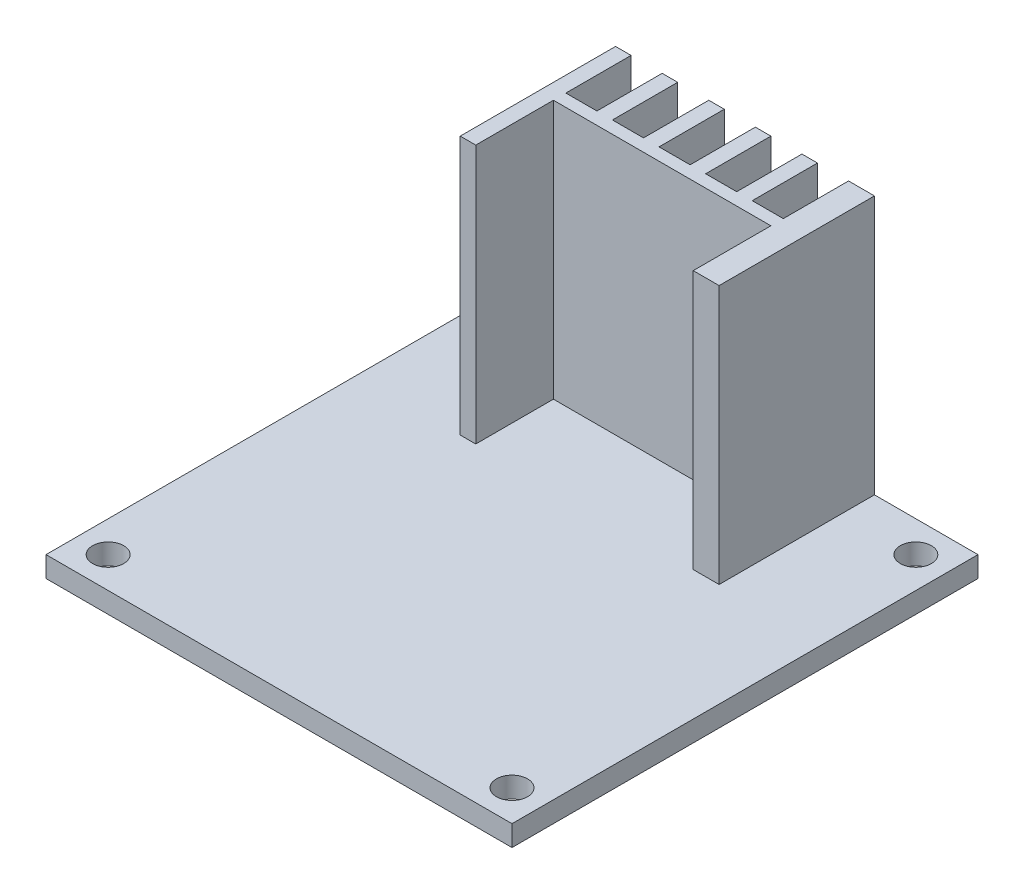
ISO-10303-21;
HEADER;
FILE_DESCRIPTION(('STEP AP214'),'2;1');
FILE_NAME('part.step','',(''),(''),'','','');
FILE_SCHEMA(('AUTOMOTIVE_DESIGN { 1 0 10303 214 1 1 1 1 }'));
ENDSEC;
DATA;
#1=APPLICATION_CONTEXT('core data for automotive mechanical design processes');
#2=APPLICATION_PROTOCOL_DEFINITION('international standard','automotive_design',2000,#1);
#3=PRODUCT_CONTEXT('',#1,'mechanical');
#4=PRODUCT('Part','Part','',(#3));
#5=PRODUCT_RELATED_PRODUCT_CATEGORY('part','',(#4));
#6=PRODUCT_DEFINITION_FORMATION('','',#4);
#7=PRODUCT_DEFINITION_CONTEXT('part definition',#1,'design');
#8=PRODUCT_DEFINITION('design','',#6,#7);
#9=PRODUCT_DEFINITION_SHAPE('','',#8);
#10=(LENGTH_UNIT() NAMED_UNIT(*) SI_UNIT(.MILLI.,.METRE.));
#11=(NAMED_UNIT(*) PLANE_ANGLE_UNIT() SI_UNIT($,.RADIAN.));
#12=(NAMED_UNIT(*) SI_UNIT($,.STERADIAN.) SOLID_ANGLE_UNIT());
#13=UNCERTAINTY_MEASURE_WITH_UNIT(LENGTH_MEASURE(1.E-05),#10,'distance_accuracy_value','');
#14=(GEOMETRIC_REPRESENTATION_CONTEXT(3) GLOBAL_UNCERTAINTY_ASSIGNED_CONTEXT((#13)) GLOBAL_UNIT_ASSIGNED_CONTEXT((#10,
#11,#12)) REPRESENTATION_CONTEXT('',''));
#15=CARTESIAN_POINT('',(0.,0.,0.));
#16=DIRECTION('',(0.,0.,1.));
#17=DIRECTION('',(1.,0.,0.));
#18=AXIS2_PLACEMENT_3D('',#15,#16,#17);
#19=CARTESIAN_POINT('',(22.5,2.,-22.5));
#20=DIRECTION('',(0.,0.,1.));
#21=DIRECTION('',(1.,0.,0.));
#22=AXIS2_PLACEMENT_3D('',#19,#20,#21);
#23=PLANE('',#22);
#24=DIRECTION('',(1.,0.,0.));
#25=VECTOR('',#24,1.);
#26=CARTESIAN_POINT('',(22.5,2.,-22.5));
#27=LINE('',#26,#25);
#28=CARTESIAN_POINT('',(-12.5,2.,-22.5));
#29=VERTEX_POINT('',#28);
#30=CARTESIAN_POINT('',(-11.,2.,-22.5));
#31=VERTEX_POINT('',#30);
#32=EDGE_CURVE('E11',#29,#31,#27,.T.);
#33=ORIENTED_EDGE('',*,*,#32,.F.);
#34=DIRECTION('',(0.,-1.,0.));
#35=VECTOR('',#34,1.);
#36=CARTESIAN_POINT('',(-12.5,27.,-22.5));
#37=LINE('',#36,#35);
#38=CARTESIAN_POINT('',(-12.5,27.,-22.5));
#39=VERTEX_POINT('',#38);
#40=EDGE_CURVE('E706',#39,#29,#37,.T.);
#41=ORIENTED_EDGE('',*,*,#40,.F.);
#42=DIRECTION('',(-1.,0.,0.));
#43=VECTOR('',#42,1.);
#44=CARTESIAN_POINT('',(0.,27.,-22.5));
#45=LINE('',#44,#43);
#46=CARTESIAN_POINT('',(-11.,27.,-22.5));
#47=VERTEX_POINT('',#46);
#48=EDGE_CURVE('E293',#47,#39,#45,.T.);
#49=ORIENTED_EDGE('',*,*,#48,.F.);
#50=DIRECTION('',(0.,-1.,0.));
#51=VECTOR('',#50,1.);
#52=CARTESIAN_POINT('',(-11.,27.,-22.5));
#53=LINE('',#52,#51);
#54=EDGE_CURVE('E455',#47,#31,#53,.T.);
#55=ORIENTED_EDGE('',*,*,#54,.T.);
#56=EDGE_LOOP('',(#33,#41,#49,#55));
#57=FACE_BOUND('',#56,.T.);
#58=ADVANCED_FACE('F41',(#57),#23,.F.);
#59=CARTESIAN_POINT('',(-7.99999999999999,2.,-22.5));
#60=VERTEX_POINT('',#59);
#61=CARTESIAN_POINT('',(-6.49999999999998,2.,-22.5));
#62=VERTEX_POINT('',#61);
#63=EDGE_CURVE('E51',#60,#62,#27,.T.);
#64=ORIENTED_EDGE('',*,*,#63,.F.);
#65=DIRECTION('',(0.,-1.,0.));
#66=VECTOR('',#65,1.);
#67=CARTESIAN_POINT('',(-8.,27.,-22.5));
#68=LINE('',#67,#66);
#69=CARTESIAN_POINT('',(-8.,27.,-22.5));
#70=VERTEX_POINT('',#69);
#71=EDGE_CURVE('E419',#70,#60,#68,.T.);
#72=ORIENTED_EDGE('',*,*,#71,.F.);
#73=CARTESIAN_POINT('',(-6.5,27.,-22.5));
#74=VERTEX_POINT('',#73);
#75=EDGE_CURVE('E332',#74,#70,#45,.T.);
#76=ORIENTED_EDGE('',*,*,#75,.F.);
#77=DIRECTION('',(0.,-1.,0.));
#78=VECTOR('',#77,1.);
#79=CARTESIAN_POINT('',(-6.5,27.,-22.5));
#80=LINE('',#79,#78);
#81=EDGE_CURVE('E414',#74,#62,#80,.T.);
#82=ORIENTED_EDGE('',*,*,#81,.T.);
#83=EDGE_LOOP('',(#64,#72,#76,#82));
#84=FACE_BOUND('',#83,.T.);
#85=ADVANCED_FACE('F415',(#84),#23,.F.);
#86=CARTESIAN_POINT('',(-3.49999999999999,2.,-22.5));
#87=VERTEX_POINT('',#86);
#88=CARTESIAN_POINT('',(-1.99999999999998,2.,-22.5));
#89=VERTEX_POINT('',#88);
#90=EDGE_CURVE('E384',#87,#89,#27,.T.);
#91=ORIENTED_EDGE('',*,*,#90,.F.);
#92=DIRECTION('',(0.,-1.,0.));
#93=VECTOR('',#92,1.);
#94=CARTESIAN_POINT('',(-3.5,27.,-22.5));
#95=LINE('',#94,#93);
#96=CARTESIAN_POINT('',(-3.5,27.,-22.5));
#97=VERTEX_POINT('',#96);
#98=EDGE_CURVE('E461',#97,#87,#95,.T.);
#99=ORIENTED_EDGE('',*,*,#98,.F.);
#100=CARTESIAN_POINT('',(-2.,27.,-22.5));
#101=VERTEX_POINT('',#100);
#102=EDGE_CURVE('E322',#101,#97,#45,.T.);
#103=ORIENTED_EDGE('',*,*,#102,.F.);
#104=DIRECTION('',(0.,-1.,0.));
#105=VECTOR('',#104,1.);
#106=CARTESIAN_POINT('',(-2.,27.,-22.5));
#107=LINE('',#106,#105);
#108=EDGE_CURVE('E466',#101,#89,#107,.T.);
#109=ORIENTED_EDGE('',*,*,#108,.T.);
#110=EDGE_LOOP('',(#91,#99,#103,#109));
#111=FACE_BOUND('',#110,.T.);
#112=ADVANCED_FACE('F612',(#111),#23,.F.);
#113=CARTESIAN_POINT('',(1.00000000000001,2.,-22.5));
#114=VERTEX_POINT('',#113);
#115=CARTESIAN_POINT('',(2.50000000000002,2.,-22.5));
#116=VERTEX_POINT('',#115);
#117=EDGE_CURVE('E381',#114,#116,#27,.T.);
#118=ORIENTED_EDGE('',*,*,#117,.F.);
#119=DIRECTION('',(0.,-1.,0.));
#120=VECTOR('',#119,1.);
#121=CARTESIAN_POINT('',(1.,27.,-22.5));
#122=LINE('',#121,#120);
#123=CARTESIAN_POINT('',(1.,27.,-22.5));
#124=VERTEX_POINT('',#123);
#125=EDGE_CURVE('E469',#124,#114,#122,.T.);
#126=ORIENTED_EDGE('',*,*,#125,.F.);
#127=CARTESIAN_POINT('',(2.5,27.,-22.5));
#128=VERTEX_POINT('',#127);
#129=EDGE_CURVE('E312',#128,#124,#45,.T.);
#130=ORIENTED_EDGE('',*,*,#129,.F.);
#131=DIRECTION('',(0.,-1.,0.));
#132=VECTOR('',#131,1.);
#133=CARTESIAN_POINT('',(2.5,27.,-22.5));
#134=LINE('',#133,#132);
#135=EDGE_CURVE('E474',#128,#116,#134,.T.);
#136=ORIENTED_EDGE('',*,*,#135,.T.);
#137=EDGE_LOOP('',(#118,#126,#130,#136));
#138=FACE_BOUND('',#137,.T.);
#139=ADVANCED_FACE('F632',(#138),#23,.F.);
#140=CARTESIAN_POINT('',(5.50000000000002,2.,-22.5));
#141=VERTEX_POINT('',#140);
#142=CARTESIAN_POINT('',(7.00000000000001,2.,-22.5));
#143=VERTEX_POINT('',#142);
#144=EDGE_CURVE('E377',#141,#143,#27,.T.);
#145=ORIENTED_EDGE('',*,*,#144,.F.);
#146=DIRECTION('',(0.,-1.,0.));
#147=VECTOR('',#146,1.);
#148=CARTESIAN_POINT('',(5.5,27.,-22.5));
#149=LINE('',#148,#147);
#150=CARTESIAN_POINT('',(5.5,27.,-22.5));
#151=VERTEX_POINT('',#150);
#152=EDGE_CURVE('E477',#151,#141,#149,.T.);
#153=ORIENTED_EDGE('',*,*,#152,.F.);
#154=CARTESIAN_POINT('',(7.,27.,-22.5));
#155=VERTEX_POINT('',#154);
#156=EDGE_CURVE('E294',#155,#151,#45,.T.);
#157=ORIENTED_EDGE('',*,*,#156,.F.);
#158=DIRECTION('',(0.,-1.,0.));
#159=VECTOR('',#158,1.);
#160=CARTESIAN_POINT('',(7.,27.,-22.5));
#161=LINE('',#160,#159);
#162=EDGE_CURVE('E482',#155,#143,#161,.T.);
#163=ORIENTED_EDGE('',*,*,#162,.T.);
#164=EDGE_LOOP('',(#145,#153,#157,#163));
#165=FACE_BOUND('',#164,.T.);
#166=ADVANCED_FACE('F625',(#165),#23,.F.);
#167=CARTESIAN_POINT('',(10.,2.,-22.5));
#168=VERTEX_POINT('',#167);
#169=CARTESIAN_POINT('',(12.5,2.,-22.5));
#170=VERTEX_POINT('',#169);
#171=EDGE_CURVE('E374',#168,#170,#27,.T.);
#172=ORIENTED_EDGE('',*,*,#171,.F.);
#173=DIRECTION('',(0.,-1.,0.));
#174=VECTOR('',#173,1.);
#175=CARTESIAN_POINT('',(10.,27.,-22.5));
#176=LINE('',#175,#174);
#177=CARTESIAN_POINT('',(10.,27.,-22.5));
#178=VERTEX_POINT('',#177);
#179=EDGE_CURVE('E371',#178,#168,#176,.T.);
#180=ORIENTED_EDGE('',*,*,#179,.F.);
#181=CARTESIAN_POINT('',(12.5,27.,-22.5));
#182=VERTEX_POINT('',#181);
#183=EDGE_CURVE('E290',#182,#178,#45,.T.);
#184=ORIENTED_EDGE('',*,*,#183,.F.);
#185=DIRECTION('',(0.,-1.,0.));
#186=VECTOR('',#185,1.);
#187=CARTESIAN_POINT('',(12.5,27.,-22.5));
#188=LINE('',#187,#186);
#189=EDGE_CURVE('E367',#182,#170,#188,.T.);
#190=ORIENTED_EDGE('',*,*,#189,.T.);
#191=EDGE_LOOP('',(#172,#180,#184,#190));
#192=FACE_BOUND('',#191,.T.);
#193=ADVANCED_FACE('F616',(#192),#23,.F.);
#194=CARTESIAN_POINT('',(0.,2.,0.));
#195=DIRECTION('',(0.,1.,0.));
#196=DIRECTION('',(0.,0.,1.));
#197=AXIS2_PLACEMENT_3D('',#194,#195,#196);
#198=PLANE('',#197);
#199=DIRECTION('',(-1.,0.,0.));
#200=VECTOR('',#199,1.);
#201=CARTESIAN_POINT('',(22.5,2.,-22.5));
#202=LINE('',#201,#200);
#203=EDGE_CURVE('E398',#60,#31,#202,.T.);
#204=ORIENTED_EDGE('',*,*,#203,.T.);
#205=DIRECTION('',(0.,0.,1.));
#206=VECTOR('',#205,1.);
#207=CARTESIAN_POINT('',(-11.,2.,0.));
#208=LINE('',#207,#206);
#209=CARTESIAN_POINT('',(-11.,2.,-16.2));
#210=VERTEX_POINT('',#209);
#211=EDGE_CURVE('E58',#31,#210,#208,.T.);
#212=ORIENTED_EDGE('',*,*,#211,.T.);
#213=DIRECTION('',(1.,0.,0.));
#214=VECTOR('',#213,1.);
#215=CARTESIAN_POINT('',(0.,2.,-16.2));
#216=LINE('',#215,#214);
#217=CARTESIAN_POINT('',(-8.,2.,-16.2));
#218=VERTEX_POINT('',#217);
#219=EDGE_CURVE('E63',#210,#218,#216,.T.);
#220=ORIENTED_EDGE('',*,*,#219,.T.);
#221=DIRECTION('',(0.,0.,-1.));
#222=VECTOR('',#221,1.);
#223=CARTESIAN_POINT('',(-8.,2.,0.));
#224=LINE('',#223,#222);
#225=EDGE_CURVE('E423',#218,#60,#224,.T.);
#226=ORIENTED_EDGE('',*,*,#225,.T.);
#227=EDGE_LOOP('',(#204,#212,#220,#226));
#228=FACE_BOUND('',#227,.T.);
#229=ADVANCED_FACE('F624',(#228),#198,.T.);
#230=EDGE_CURVE('E396',#87,#62,#202,.T.);
#231=ORIENTED_EDGE('',*,*,#230,.T.);
#232=DIRECTION('',(0.,0.,1.));
#233=VECTOR('',#232,1.);
#234=CARTESIAN_POINT('',(-6.5,2.,0.));
#235=LINE('',#234,#233);
#236=CARTESIAN_POINT('',(-6.5,2.,-16.2));
#237=VERTEX_POINT('',#236);
#238=EDGE_CURVE('E407',#62,#237,#235,.T.);
#239=ORIENTED_EDGE('',*,*,#238,.T.);
#240=DIRECTION('',(1.,0.,0.));
#241=VECTOR('',#240,1.);
#242=CARTESIAN_POINT('',(0.,2.,-16.2));
#243=LINE('',#242,#241);
#244=CARTESIAN_POINT('',(-3.5,2.,-16.2));
#245=VERTEX_POINT('',#244);
#246=EDGE_CURVE('E424',#237,#245,#243,.T.);
#247=ORIENTED_EDGE('',*,*,#246,.T.);
#248=DIRECTION('',(0.,0.,-1.));
#249=VECTOR('',#248,1.);
#250=CARTESIAN_POINT('',(-3.5,2.,0.));
#251=LINE('',#250,#249);
#252=EDGE_CURVE('E410',#245,#87,#251,.T.);
#253=ORIENTED_EDGE('',*,*,#252,.T.);
#254=EDGE_LOOP('',(#231,#239,#247,#253));
#255=FACE_BOUND('',#254,.T.);
#256=ADVANCED_FACE('F405',(#255),#198,.T.);
#257=EDGE_CURVE('E411',#114,#89,#202,.T.);
#258=ORIENTED_EDGE('',*,*,#257,.T.);
#259=DIRECTION('',(0.,0.,1.));
#260=VECTOR('',#259,1.);
#261=CARTESIAN_POINT('',(-2.,2.,0.));
#262=LINE('',#261,#260);
#263=CARTESIAN_POINT('',(-2.,2.,-16.2));
#264=VERTEX_POINT('',#263);
#265=EDGE_CURVE('E958',#89,#264,#262,.T.);
#266=ORIENTED_EDGE('',*,*,#265,.T.);
#267=DIRECTION('',(1.,0.,0.));
#268=VECTOR('',#267,1.);
#269=CARTESIAN_POINT('',(0.,2.,-16.2));
#270=LINE('',#269,#268);
#271=CARTESIAN_POINT('',(1.,2.,-16.2));
#272=VERTEX_POINT('',#271);
#273=EDGE_CURVE('E668',#264,#272,#270,.T.);
#274=ORIENTED_EDGE('',*,*,#273,.T.);
#275=DIRECTION('',(0.,0.,-1.));
#276=VECTOR('',#275,1.);
#277=CARTESIAN_POINT('',(1.,2.,0.));
#278=LINE('',#277,#276);
#279=EDGE_CURVE('E672',#272,#114,#278,.T.);
#280=ORIENTED_EDGE('',*,*,#279,.T.);
#281=EDGE_LOOP('',(#258,#266,#274,#280));
#282=FACE_BOUND('',#281,.T.);
#283=ADVANCED_FACE('F947',(#282),#198,.T.);
#284=EDGE_CURVE('E544',#141,#116,#202,.T.);
#285=ORIENTED_EDGE('',*,*,#284,.T.);
#286=DIRECTION('',(0.,0.,1.));
#287=VECTOR('',#286,1.);
#288=CARTESIAN_POINT('',(2.50000000000001,2.,0.));
#289=LINE('',#288,#287);
#290=CARTESIAN_POINT('',(2.5,2.,-16.2));
#291=VERTEX_POINT('',#290);
#292=EDGE_CURVE('E665',#116,#291,#289,.T.);
#293=ORIENTED_EDGE('',*,*,#292,.T.);
#294=DIRECTION('',(1.,0.,0.));
#295=VECTOR('',#294,1.);
#296=CARTESIAN_POINT('',(0.,2.,-16.2));
#297=LINE('',#296,#295);
#298=CARTESIAN_POINT('',(5.5,2.,-16.2));
#299=VERTEX_POINT('',#298);
#300=EDGE_CURVE('E663',#291,#299,#297,.T.);
#301=ORIENTED_EDGE('',*,*,#300,.T.);
#302=DIRECTION('',(0.,0.,-1.));
#303=VECTOR('',#302,1.);
#304=CARTESIAN_POINT('',(5.5,2.,0.));
#305=LINE('',#304,#303);
#306=EDGE_CURVE('E658',#299,#141,#305,.T.);
#307=ORIENTED_EDGE('',*,*,#306,.T.);
#308=EDGE_LOOP('',(#285,#293,#301,#307));
#309=FACE_BOUND('',#308,.T.);
#310=ADVANCED_FACE('F981',(#309),#198,.T.);
#311=EDGE_CURVE('E541',#168,#143,#202,.T.);
#312=ORIENTED_EDGE('',*,*,#311,.T.);
#313=DIRECTION('',(0.,0.,1.));
#314=VECTOR('',#313,1.);
#315=CARTESIAN_POINT('',(7.,2.,0.));
#316=LINE('',#315,#314);
#317=CARTESIAN_POINT('',(7.,2.,-16.2));
#318=VERTEX_POINT('',#317);
#319=EDGE_CURVE('E656',#143,#318,#316,.T.);
#320=ORIENTED_EDGE('',*,*,#319,.T.);
#321=DIRECTION('',(1.,0.,0.));
#322=VECTOR('',#321,1.);
#323=CARTESIAN_POINT('',(0.,2.,-16.2));
#324=LINE('',#323,#322);
#325=CARTESIAN_POINT('',(10.,2.,-16.2));
#326=VERTEX_POINT('',#325);
#327=EDGE_CURVE('E358',#318,#326,#324,.T.);
#328=ORIENTED_EDGE('',*,*,#327,.T.);
#329=DIRECTION('',(0.,0.,-1.));
#330=VECTOR('',#329,1.);
#331=CARTESIAN_POINT('',(10.,2.,0.));
#332=LINE('',#331,#330);
#333=EDGE_CURVE('E364',#326,#168,#332,.T.);
#334=ORIENTED_EDGE('',*,*,#333,.T.);
#335=EDGE_LOOP('',(#312,#320,#328,#334));
#336=FACE_BOUND('',#335,.T.);
#337=ADVANCED_FACE('F645',(#336),#198,.T.);
#338=CARTESIAN_POINT('',(-19.5,2.,19.5));
#339=DIRECTION('',(0.,1.,0.));
#340=DIRECTION('',(0.,0.,1.));
#341=AXIS2_PLACEMENT_3D('',#338,#339,#340);
#342=CIRCLE('',#341,1.5);
#343=CARTESIAN_POINT('',(-19.5,2.,21.));
#344=VERTEX_POINT('',#343);
#345=EDGE_CURVE('E500',#344,#344,#342,.T.);
#346=ORIENTED_EDGE('',*,*,#345,.F.);
#347=EDGE_LOOP('',(#346));
#348=FACE_BOUND('',#347,.T.);
#349=CARTESIAN_POINT('',(-19.5,2.,-19.5));
#350=DIRECTION('',(0.,1.,0.));
#351=DIRECTION('',(0.,0.,1.));
#352=AXIS2_PLACEMENT_3D('',#349,#350,#351);
#353=CIRCLE('',#352,1.5);
#354=CARTESIAN_POINT('',(-19.5,2.,-18.));
#355=VERTEX_POINT('',#354);
#356=EDGE_CURVE('E512',#355,#355,#353,.T.);
#357=ORIENTED_EDGE('',*,*,#356,.F.);
#358=EDGE_LOOP('',(#357));
#359=FACE_BOUND('',#358,.T.);
#360=CARTESIAN_POINT('',(19.5,2.,-19.5));
#361=DIRECTION('',(0.,1.,0.));
#362=DIRECTION('',(0.,0.,1.));
#363=AXIS2_PLACEMENT_3D('',#360,#361,#362);
#364=CIRCLE('',#363,1.5);
#365=CARTESIAN_POINT('',(19.5,2.,-18.));
#366=VERTEX_POINT('',#365);
#367=EDGE_CURVE('E506',#366,#366,#364,.T.);
#368=ORIENTED_EDGE('',*,*,#367,.F.);
#369=EDGE_LOOP('',(#368));
#370=FACE_BOUND('',#369,.T.);
#371=CARTESIAN_POINT('',(19.5,2.,19.5));
#372=DIRECTION('',(0.,1.,0.));
#373=DIRECTION('',(0.,0.,1.));
#374=AXIS2_PLACEMENT_3D('',#371,#372,#373);
#375=CIRCLE('',#374,1.5);
#376=CARTESIAN_POINT('',(19.5,2.,21.));
#377=VERTEX_POINT('',#376);
#378=EDGE_CURVE('E494',#377,#377,#375,.T.);
#379=ORIENTED_EDGE('',*,*,#378,.F.);
#380=EDGE_LOOP('',(#379));
#381=FACE_BOUND('',#380,.T.);
#382=DIRECTION('',(-1.,0.,0.));
#383=VECTOR('',#382,1.);
#384=CARTESIAN_POINT('',(0.,2.,-7.5));
#385=LINE('',#384,#383);
#386=CARTESIAN_POINT('',(-11.,2.,-7.5));
#387=VERTEX_POINT('',#386);
#388=CARTESIAN_POINT('',(-12.5,2.,-7.5));
#389=VERTEX_POINT('',#388);
#390=EDGE_CURVE('E260',#387,#389,#385,.T.);
#391=ORIENTED_EDGE('',*,*,#390,.T.);
#392=DIRECTION('',(0.,0.,-1.));
#393=VECTOR('',#392,1.);
#394=CARTESIAN_POINT('',(-12.5,2.,0.));
#395=LINE('',#394,#393);
#396=EDGE_CURVE('E277',#389,#29,#395,.T.);
#397=ORIENTED_EDGE('',*,*,#396,.T.);
#398=CARTESIAN_POINT('',(-22.5,2.,-22.5));
#399=VERTEX_POINT('',#398);
#400=EDGE_CURVE('E526',#29,#399,#202,.T.);
#401=ORIENTED_EDGE('',*,*,#400,.T.);
#402=DIRECTION('',(0.,0.,1.));
#403=VECTOR('',#402,1.);
#404=CARTESIAN_POINT('',(-22.5,2.,22.5));
#405=LINE('',#404,#403);
#406=CARTESIAN_POINT('',(-22.5,2.,22.5));
#407=VERTEX_POINT('',#406);
#408=EDGE_CURVE('E518',#399,#407,#405,.T.);
#409=ORIENTED_EDGE('',*,*,#408,.T.);
#410=DIRECTION('',(1.,0.,0.));
#411=VECTOR('',#410,1.);
#412=CARTESIAN_POINT('',(22.5,2.,22.5));
#413=LINE('',#412,#411);
#414=CARTESIAN_POINT('',(22.5,2.,22.5));
#415=VERTEX_POINT('',#414);
#416=EDGE_CURVE('E521',#407,#415,#413,.T.);
#417=ORIENTED_EDGE('',*,*,#416,.T.);
#418=DIRECTION('',(0.,0.,-1.));
#419=VECTOR('',#418,1.);
#420=CARTESIAN_POINT('',(22.5,2.,22.5));
#421=LINE('',#420,#419);
#422=CARTESIAN_POINT('',(22.5,2.,-22.5));
#423=VERTEX_POINT('',#422);
#424=EDGE_CURVE('E524',#415,#423,#421,.T.);
#425=ORIENTED_EDGE('',*,*,#424,.T.);
#426=EDGE_CURVE('E537',#423,#170,#202,.T.);
#427=ORIENTED_EDGE('',*,*,#426,.T.);
#428=DIRECTION('',(0.,0.,-1.));
#429=VECTOR('',#428,1.);
#430=CARTESIAN_POINT('',(12.5,2.,0.));
#431=LINE('',#430,#429);
#432=CARTESIAN_POINT('',(12.5,2.,-7.50000000000001));
#433=VERTEX_POINT('',#432);
#434=EDGE_CURVE('E355',#433,#170,#431,.T.);
#435=ORIENTED_EDGE('',*,*,#434,.F.);
#436=DIRECTION('',(-1.,0.,0.));
#437=VECTOR('',#436,1.);
#438=CARTESIAN_POINT('',(0.,2.,-7.50000000000001));
#439=LINE('',#438,#437);
#440=CARTESIAN_POINT('',(10.,2.,-7.50000000000001));
#441=VERTEX_POINT('',#440);
#442=EDGE_CURVE('E353',#433,#441,#439,.T.);
#443=ORIENTED_EDGE('',*,*,#442,.T.);
#444=DIRECTION('',(0.,0.,1.));
#445=VECTOR('',#444,1.);
#446=CARTESIAN_POINT('',(10.,2.,0.));
#447=LINE('',#446,#445);
#448=CARTESIAN_POINT('',(10.,2.,-15.));
#449=VERTEX_POINT('',#448);
#450=EDGE_CURVE('E350',#449,#441,#447,.T.);
#451=ORIENTED_EDGE('',*,*,#450,.F.);
#452=DIRECTION('',(1.,0.,0.));
#453=VECTOR('',#452,1.);
#454=CARTESIAN_POINT('',(0.,2.,-15.));
#455=LINE('',#454,#453);
#456=CARTESIAN_POINT('',(-11.,2.,-15.));
#457=VERTEX_POINT('',#456);
#458=EDGE_CURVE('E347',#457,#449,#455,.T.);
#459=ORIENTED_EDGE('',*,*,#458,.F.);
#460=DIRECTION('',(0.,0.,-1.));
#461=VECTOR('',#460,1.);
#462=CARTESIAN_POINT('',(-11.,2.,0.));
#463=LINE('',#462,#461);
#464=EDGE_CURVE('E345',#387,#457,#463,.T.);
#465=ORIENTED_EDGE('',*,*,#464,.F.);
#466=EDGE_LOOP('',(#391,#397,#401,#409,#417,#425,#427,#435,#443,#451,#459,#465));
#467=FACE_BOUND('',#466,.T.);
#468=ADVANCED_FACE('F549',(#348,#359,#370,#381,#467),#198,.T.);
#469=CARTESIAN_POINT('',(0.,0.,0.));
#470=DIRECTION('',(0.,1.,0.));
#471=DIRECTION('',(0.,0.,1.));
#472=AXIS2_PLACEMENT_3D('',#469,#470,#471);
#473=PLANE('',#472);
#474=DIRECTION('',(0.,0.,1.));
#475=VECTOR('',#474,1.);
#476=CARTESIAN_POINT('',(-22.5,0.,22.5));
#477=LINE('',#476,#475);
#478=CARTESIAN_POINT('',(-22.5,0.,-22.5));
#479=VERTEX_POINT('',#478);
#480=CARTESIAN_POINT('',(-22.5,0.,22.5));
#481=VERTEX_POINT('',#480);
#482=EDGE_CURVE('E515',#479,#481,#477,.T.);
#483=ORIENTED_EDGE('',*,*,#482,.F.);
#484=DIRECTION('',(-1.,0.,0.));
#485=VECTOR('',#484,1.);
#486=CARTESIAN_POINT('',(22.5,0.,-22.5));
#487=LINE('',#486,#485);
#488=CARTESIAN_POINT('',(22.5,0.,-22.5));
#489=VERTEX_POINT('',#488);
#490=EDGE_CURVE('E522',#489,#479,#487,.T.);
#491=ORIENTED_EDGE('',*,*,#490,.F.);
#492=DIRECTION('',(0.,0.,-1.));
#493=VECTOR('',#492,1.);
#494=CARTESIAN_POINT('',(22.5,0.,22.5));
#495=LINE('',#494,#493);
#496=CARTESIAN_POINT('',(22.5,0.,22.5));
#497=VERTEX_POINT('',#496);
#498=EDGE_CURVE('E571',#497,#489,#495,.T.);
#499=ORIENTED_EDGE('',*,*,#498,.F.);
#500=DIRECTION('',(1.,0.,0.));
#501=VECTOR('',#500,1.);
#502=CARTESIAN_POINT('',(22.5,0.,22.5));
#503=LINE('',#502,#501);
#504=EDGE_CURVE('E572',#481,#497,#503,.T.);
#505=ORIENTED_EDGE('',*,*,#504,.F.);
#506=EDGE_LOOP('',(#483,#491,#499,#505));
#507=FACE_BOUND('',#506,.T.);
#508=CARTESIAN_POINT('',(-19.5,0.,-19.5));
#509=DIRECTION('',(0.,1.,0.));
#510=DIRECTION('',(0.,0.,1.));
#511=AXIS2_PLACEMENT_3D('',#508,#509,#510);
#512=CIRCLE('',#511,1.5);
#513=CARTESIAN_POINT('',(-19.5,0.,-18.));
#514=VERTEX_POINT('',#513);
#515=EDGE_CURVE('E509',#514,#514,#512,.T.);
#516=ORIENTED_EDGE('',*,*,#515,.T.);
#517=EDGE_LOOP('',(#516));
#518=FACE_BOUND('',#517,.T.);
#519=CARTESIAN_POINT('',(19.5,0.,-19.5));
#520=DIRECTION('',(0.,1.,0.));
#521=DIRECTION('',(0.,0.,1.));
#522=AXIS2_PLACEMENT_3D('',#519,#520,#521);
#523=CIRCLE('',#522,1.5);
#524=CARTESIAN_POINT('',(19.5,0.,-18.));
#525=VERTEX_POINT('',#524);
#526=EDGE_CURVE('E503',#525,#525,#523,.T.);
#527=ORIENTED_EDGE('',*,*,#526,.T.);
#528=EDGE_LOOP('',(#527));
#529=FACE_BOUND('',#528,.T.);
#530=CARTESIAN_POINT('',(-19.5,0.,19.5));
#531=DIRECTION('',(0.,1.,0.));
#532=DIRECTION('',(0.,0.,1.));
#533=AXIS2_PLACEMENT_3D('',#530,#531,#532);
#534=CIRCLE('',#533,1.5);
#535=CARTESIAN_POINT('',(-19.5,0.,21.));
#536=VERTEX_POINT('',#535);
#537=EDGE_CURVE('E497',#536,#536,#534,.T.);
#538=ORIENTED_EDGE('',*,*,#537,.T.);
#539=EDGE_LOOP('',(#538));
#540=FACE_BOUND('',#539,.T.);
#541=CARTESIAN_POINT('',(19.5,0.,19.5));
#542=DIRECTION('',(0.,1.,0.));
#543=DIRECTION('',(0.,0.,1.));
#544=AXIS2_PLACEMENT_3D('',#541,#542,#543);
#545=CIRCLE('',#544,1.5);
#546=CARTESIAN_POINT('',(19.5,0.,21.));
#547=VERTEX_POINT('',#546);
#548=EDGE_CURVE('E263',#547,#547,#545,.T.);
#549=ORIENTED_EDGE('',*,*,#548,.T.);
#550=EDGE_LOOP('',(#549));
#551=FACE_BOUND('',#550,.T.);
#552=ADVANCED_FACE('F581',(#507,#518,#529,#540,#551),#473,.F.);
#553=CARTESIAN_POINT('',(-22.5,2.,22.5));
#554=DIRECTION('',(1.,0.,0.));
#555=DIRECTION('',(0.,0.,-1.));
#556=AXIS2_PLACEMENT_3D('',#553,#554,#555);
#557=PLANE('',#556);
#558=ORIENTED_EDGE('',*,*,#482,.T.);
#559=DIRECTION('',(0.,-1.,0.));
#560=VECTOR('',#559,1.);
#561=CARTESIAN_POINT('',(-22.5,2.,22.5));
#562=LINE('',#561,#560);
#563=EDGE_CURVE('E378',#407,#481,#562,.T.);
#564=ORIENTED_EDGE('',*,*,#563,.F.);
#565=ORIENTED_EDGE('',*,*,#408,.F.);
#566=DIRECTION('',(0.,-1.,0.));
#567=VECTOR('',#566,1.);
#568=CARTESIAN_POINT('',(-22.5,2.,-22.5));
#569=LINE('',#568,#567);
#570=EDGE_CURVE('E555',#399,#479,#569,.T.);
#571=ORIENTED_EDGE('',*,*,#570,.T.);
#572=EDGE_LOOP('',(#558,#564,#565,#571));
#573=FACE_BOUND('',#572,.T.);
#574=ADVANCED_FACE('F43',(#573),#557,.F.);
#575=CARTESIAN_POINT('',(22.5,2.,22.5));
#576=DIRECTION('',(0.,0.,-1.));
#577=DIRECTION('',(-1.,0.,0.));
#578=AXIS2_PLACEMENT_3D('',#575,#576,#577);
#579=PLANE('',#578);
#580=ORIENTED_EDGE('',*,*,#504,.T.);
#581=DIRECTION('',(0.,-1.,0.));
#582=VECTOR('',#581,1.);
#583=CARTESIAN_POINT('',(22.5,2.,22.5));
#584=LINE('',#583,#582);
#585=EDGE_CURVE('E565',#415,#497,#584,.T.);
#586=ORIENTED_EDGE('',*,*,#585,.F.);
#587=ORIENTED_EDGE('',*,*,#416,.F.);
#588=ORIENTED_EDGE('',*,*,#563,.T.);
#589=EDGE_LOOP('',(#580,#586,#587,#588));
#590=FACE_BOUND('',#589,.T.);
#591=ADVANCED_FACE('F574',(#590),#579,.F.);
#592=CARTESIAN_POINT('',(22.5,2.,22.5));
#593=DIRECTION('',(-1.,0.,0.));
#594=DIRECTION('',(0.,0.,1.));
#595=AXIS2_PLACEMENT_3D('',#592,#593,#594);
#596=PLANE('',#595);
#597=ORIENTED_EDGE('',*,*,#498,.T.);
#598=DIRECTION('',(0.,-1.,0.));
#599=VECTOR('',#598,1.);
#600=CARTESIAN_POINT('',(22.5,2.,-22.5));
#601=LINE('',#600,#599);
#602=EDGE_CURVE('E561',#423,#489,#601,.T.);
#603=ORIENTED_EDGE('',*,*,#602,.F.);
#604=ORIENTED_EDGE('',*,*,#424,.F.);
#605=ORIENTED_EDGE('',*,*,#585,.T.);
#606=EDGE_LOOP('',(#597,#603,#604,#605));
#607=FACE_BOUND('',#606,.T.);
#608=ADVANCED_FACE('F579',(#607),#596,.F.);
#609=ORIENTED_EDGE('',*,*,#400,.F.);
#610=ORIENTED_EDGE('',*,*,#32,.T.);
#611=ORIENTED_EDGE('',*,*,#203,.F.);
#612=ORIENTED_EDGE('',*,*,#63,.T.);
#613=ORIENTED_EDGE('',*,*,#230,.F.);
#614=ORIENTED_EDGE('',*,*,#90,.T.);
#615=ORIENTED_EDGE('',*,*,#257,.F.);
#616=ORIENTED_EDGE('',*,*,#117,.T.);
#617=ORIENTED_EDGE('',*,*,#284,.F.);
#618=ORIENTED_EDGE('',*,*,#144,.T.);
#619=ORIENTED_EDGE('',*,*,#311,.F.);
#620=ORIENTED_EDGE('',*,*,#171,.T.);
#621=ORIENTED_EDGE('',*,*,#426,.F.);
#622=ORIENTED_EDGE('',*,*,#602,.T.);
#623=ORIENTED_EDGE('',*,*,#490,.T.);
#624=ORIENTED_EDGE('',*,*,#570,.F.);
#625=EDGE_LOOP('',(#609,#610,#611,#612,#613,#614,#615,#616,#617,#618,#619,#620,#621,#622,#623,#624));
#626=FACE_BOUND('',#625,.T.);
#627=ADVANCED_FACE('F395',(#626),#23,.F.);
#628=CARTESIAN_POINT('',(-19.5,2.,-19.5));
#629=DIRECTION('',(0.,-1.,0.));
#630=DIRECTION('',(0.,0.,-1.));
#631=AXIS2_PLACEMENT_3D('',#628,#629,#630);
#632=CYLINDRICAL_SURFACE('',#631,1.5);
#633=ORIENTED_EDGE('',*,*,#356,.T.);
#634=EDGE_LOOP('',(#633));
#635=FACE_BOUND('',#634,.T.);
#636=ORIENTED_EDGE('',*,*,#515,.F.);
#637=EDGE_LOOP('',(#636));
#638=FACE_BOUND('',#637,.T.);
#639=ADVANCED_FACE('F615',(#635,#638),#632,.F.);
#640=CARTESIAN_POINT('',(19.5,2.,-19.5));
#641=DIRECTION('',(0.,-1.,0.));
#642=DIRECTION('',(0.,0.,-1.));
#643=AXIS2_PLACEMENT_3D('',#640,#641,#642);
#644=CYLINDRICAL_SURFACE('',#643,1.5);
#645=ORIENTED_EDGE('',*,*,#367,.T.);
#646=EDGE_LOOP('',(#645));
#647=FACE_BOUND('',#646,.T.);
#648=ORIENTED_EDGE('',*,*,#526,.F.);
#649=EDGE_LOOP('',(#648));
#650=FACE_BOUND('',#649,.T.);
#651=ADVANCED_FACE('F603',(#647,#650),#644,.F.);
#652=CARTESIAN_POINT('',(-19.5,2.,19.5));
#653=DIRECTION('',(0.,-1.,0.));
#654=DIRECTION('',(0.,0.,-1.));
#655=AXIS2_PLACEMENT_3D('',#652,#653,#654);
#656=CYLINDRICAL_SURFACE('',#655,1.5);
#657=ORIENTED_EDGE('',*,*,#345,.T.);
#658=EDGE_LOOP('',(#657));
#659=FACE_BOUND('',#658,.T.);
#660=ORIENTED_EDGE('',*,*,#537,.F.);
#661=EDGE_LOOP('',(#660));
#662=FACE_BOUND('',#661,.T.);
#663=ADVANCED_FACE('F595',(#659,#662),#656,.F.);
#664=CARTESIAN_POINT('',(19.5,2.,19.5));
#665=DIRECTION('',(0.,-1.,0.));
#666=DIRECTION('',(0.,0.,-1.));
#667=AXIS2_PLACEMENT_3D('',#664,#665,#666);
#668=CYLINDRICAL_SURFACE('',#667,1.5);
#669=ORIENTED_EDGE('',*,*,#378,.T.);
#670=EDGE_LOOP('',(#669));
#671=FACE_BOUND('',#670,.T.);
#672=ORIENTED_EDGE('',*,*,#548,.F.);
#673=EDGE_LOOP('',(#672));
#674=FACE_BOUND('',#673,.T.);
#675=ADVANCED_FACE('F593',(#671,#674),#668,.F.);
#676=CARTESIAN_POINT('',(0.,27.,-7.5));
#677=DIRECTION('',(0.,0.,1.));
#678=DIRECTION('',(1.,0.,0.));
#679=AXIS2_PLACEMENT_3D('',#676,#677,#678);
#680=PLANE('',#679);
#681=ORIENTED_EDGE('',*,*,#390,.F.);
#682=DIRECTION('',(0.,-1.,0.));
#683=VECTOR('',#682,1.);
#684=CARTESIAN_POINT('',(-11.,27.,-7.5));
#685=LINE('',#684,#683);
#686=CARTESIAN_POINT('',(-11.,27.,-7.5));
#687=VERTEX_POINT('',#686);
#688=EDGE_CURVE('E253',#687,#387,#685,.T.);
#689=ORIENTED_EDGE('',*,*,#688,.F.);
#690=DIRECTION('',(-1.,0.,0.));
#691=VECTOR('',#690,1.);
#692=CARTESIAN_POINT('',(0.,27.,-7.5));
#693=LINE('',#692,#691);
#694=CARTESIAN_POINT('',(-12.5,27.,-7.5));
#695=VERTEX_POINT('',#694);
#696=EDGE_CURVE('E258',#687,#695,#693,.T.);
#697=ORIENTED_EDGE('',*,*,#696,.T.);
#698=DIRECTION('',(0.,-1.,0.));
#699=VECTOR('',#698,1.);
#700=CARTESIAN_POINT('',(-12.5,27.,-7.5));
#701=LINE('',#700,#699);
#702=EDGE_CURVE('E343',#695,#389,#701,.T.);
#703=ORIENTED_EDGE('',*,*,#702,.T.);
#704=EDGE_LOOP('',(#681,#689,#697,#703));
#705=FACE_BOUND('',#704,.T.);
#706=ADVANCED_FACE('F255',(#705),#680,.T.);
#707=CARTESIAN_POINT('',(-11.,27.,0.));
#708=DIRECTION('',(-1.,0.,0.));
#709=DIRECTION('',(0.,0.,1.));
#710=AXIS2_PLACEMENT_3D('',#707,#708,#709);
#711=PLANE('',#710);
#712=ORIENTED_EDGE('',*,*,#464,.T.);
#713=DIRECTION('',(0.,-1.,0.));
#714=VECTOR('',#713,1.);
#715=CARTESIAN_POINT('',(-11.,27.,-15.));
#716=LINE('',#715,#714);
#717=CARTESIAN_POINT('',(-11.,27.,-15.));
#718=VERTEX_POINT('',#717);
#719=EDGE_CURVE('E264',#718,#457,#716,.T.);
#720=ORIENTED_EDGE('',*,*,#719,.F.);
#721=DIRECTION('',(0.,0.,-1.));
#722=VECTOR('',#721,1.);
#723=CARTESIAN_POINT('',(-11.,27.,0.));
#724=LINE('',#723,#722);
#725=EDGE_CURVE('E267',#687,#718,#724,.T.);
#726=ORIENTED_EDGE('',*,*,#725,.F.);
#727=ORIENTED_EDGE('',*,*,#688,.T.);
#728=EDGE_LOOP('',(#712,#720,#726,#727));
#729=FACE_BOUND('',#728,.T.);
#730=ADVANCED_FACE('F268',(#729),#711,.F.);
#731=CARTESIAN_POINT('',(0.,27.,-15.));
#732=DIRECTION('',(0.,0.,-1.));
#733=DIRECTION('',(-1.,0.,0.));
#734=AXIS2_PLACEMENT_3D('',#731,#732,#733);
#735=PLANE('',#734);
#736=ORIENTED_EDGE('',*,*,#458,.T.);
#737=DIRECTION('',(0.,-1.,0.));
#738=VECTOR('',#737,1.);
#739=CARTESIAN_POINT('',(10.,27.,-15.));
#740=LINE('',#739,#738);
#741=CARTESIAN_POINT('',(10.,27.,-15.));
#742=VERTEX_POINT('',#741);
#743=EDGE_CURVE('E490',#742,#449,#740,.T.);
#744=ORIENTED_EDGE('',*,*,#743,.F.);
#745=DIRECTION('',(1.,0.,0.));
#746=VECTOR('',#745,1.);
#747=CARTESIAN_POINT('',(0.,27.,-15.));
#748=LINE('',#747,#746);
#749=EDGE_CURVE('E272',#718,#742,#748,.T.);
#750=ORIENTED_EDGE('',*,*,#749,.F.);
#751=ORIENTED_EDGE('',*,*,#719,.T.);
#752=EDGE_LOOP('',(#736,#744,#750,#751));
#753=FACE_BOUND('',#752,.T.);
#754=ADVANCED_FACE('F704',(#753),#735,.F.);
#755=CARTESIAN_POINT('',(10.,27.,0.));
#756=DIRECTION('',(1.,0.,0.));
#757=DIRECTION('',(0.,0.,-1.));
#758=AXIS2_PLACEMENT_3D('',#755,#756,#757);
#759=PLANE('',#758);
#760=ORIENTED_EDGE('',*,*,#450,.T.);
#761=DIRECTION('',(0.,-1.,0.));
#762=VECTOR('',#761,1.);
#763=CARTESIAN_POINT('',(10.,27.,-7.50000000000001));
#764=LINE('',#763,#762);
#765=CARTESIAN_POINT('',(10.,27.,-7.50000000000001));
#766=VERTEX_POINT('',#765);
#767=EDGE_CURVE('E487',#766,#441,#764,.T.);
#768=ORIENTED_EDGE('',*,*,#767,.F.);
#769=DIRECTION('',(0.,0.,1.));
#770=VECTOR('',#769,1.);
#771=CARTESIAN_POINT('',(10.,27.,0.));
#772=LINE('',#771,#770);
#773=EDGE_CURVE('E283',#742,#766,#772,.T.);
#774=ORIENTED_EDGE('',*,*,#773,.F.);
#775=ORIENTED_EDGE('',*,*,#743,.T.);
#776=EDGE_LOOP('',(#760,#768,#774,#775));
#777=FACE_BOUND('',#776,.T.);
#778=ADVANCED_FACE('F701',(#777),#759,.F.);
#779=CARTESIAN_POINT('',(0.,27.,-7.50000000000001));
#780=DIRECTION('',(0.,0.,1.));
#781=DIRECTION('',(1.,0.,0.));
#782=AXIS2_PLACEMENT_3D('',#779,#780,#781);
#783=PLANE('',#782);
#784=ORIENTED_EDGE('',*,*,#442,.F.);
#785=DIRECTION('',(0.,-1.,0.));
#786=VECTOR('',#785,1.);
#787=CARTESIAN_POINT('',(12.5,27.,-7.50000000000001));
#788=LINE('',#787,#786);
#789=CARTESIAN_POINT('',(12.5,27.,-7.50000000000001));
#790=VERTEX_POINT('',#789);
#791=EDGE_CURVE('E370',#790,#433,#788,.T.);
#792=ORIENTED_EDGE('',*,*,#791,.F.);
#793=DIRECTION('',(-1.,0.,0.));
#794=VECTOR('',#793,1.);
#795=CARTESIAN_POINT('',(0.,27.,-7.50000000000001));
#796=LINE('',#795,#794);
#797=EDGE_CURVE('E285',#790,#766,#796,.T.);
#798=ORIENTED_EDGE('',*,*,#797,.T.);
#799=ORIENTED_EDGE('',*,*,#767,.T.);
#800=EDGE_LOOP('',(#784,#792,#798,#799));
#801=FACE_BOUND('',#800,.T.);
#802=ADVANCED_FACE('F698',(#801),#783,.T.);
#803=CARTESIAN_POINT('',(12.5,27.,0.));
#804=DIRECTION('',(-1.,0.,0.));
#805=DIRECTION('',(0.,0.,1.));
#806=AXIS2_PLACEMENT_3D('',#803,#804,#805);
#807=PLANE('',#806);
#808=ORIENTED_EDGE('',*,*,#434,.T.);
#809=ORIENTED_EDGE('',*,*,#189,.F.);
#810=DIRECTION('',(0.,0.,-1.));
#811=VECTOR('',#810,1.);
#812=CARTESIAN_POINT('',(12.5,27.,0.));
#813=LINE('',#812,#811);
#814=EDGE_CURVE('E288',#790,#182,#813,.T.);
#815=ORIENTED_EDGE('',*,*,#814,.F.);
#816=ORIENTED_EDGE('',*,*,#791,.T.);
#817=EDGE_LOOP('',(#808,#809,#815,#816));
#818=FACE_BOUND('',#817,.T.);
#819=ADVANCED_FACE('F694',(#818),#807,.F.);
#820=CARTESIAN_POINT('',(10.,27.,0.));
#821=DIRECTION('',(-1.,0.,0.));
#822=DIRECTION('',(0.,0.,1.));
#823=AXIS2_PLACEMENT_3D('',#820,#821,#822);
#824=PLANE('',#823);
#825=ORIENTED_EDGE('',*,*,#333,.F.);
#826=DIRECTION('',(0.,-1.,0.));
#827=VECTOR('',#826,1.);
#828=CARTESIAN_POINT('',(10.,27.,-16.2));
#829=LINE('',#828,#827);
#830=CARTESIAN_POINT('',(10.,27.,-16.2));
#831=VERTEX_POINT('',#830);
#832=EDGE_CURVE('E481',#831,#326,#829,.T.);
#833=ORIENTED_EDGE('',*,*,#832,.F.);
#834=DIRECTION('',(0.,0.,-1.));
#835=VECTOR('',#834,1.);
#836=CARTESIAN_POINT('',(10.,27.,0.));
#837=LINE('',#836,#835);
#838=EDGE_CURVE('E292',#831,#178,#837,.T.);
#839=ORIENTED_EDGE('',*,*,#838,.T.);
#840=ORIENTED_EDGE('',*,*,#179,.T.);
#841=EDGE_LOOP('',(#825,#833,#839,#840));
#842=FACE_BOUND('',#841,.T.);
#843=ADVANCED_FACE('F651',(#842),#824,.T.);
#844=CARTESIAN_POINT('',(0.,27.,-16.2));
#845=DIRECTION('',(0.,0.,-1.));
#846=DIRECTION('',(-1.,0.,0.));
#847=AXIS2_PLACEMENT_3D('',#844,#845,#846);
#848=PLANE('',#847);
#849=ORIENTED_EDGE('',*,*,#327,.F.);
#850=DIRECTION('',(0.,-1.,0.));
#851=VECTOR('',#850,1.);
#852=CARTESIAN_POINT('',(7.,27.,-16.2));
#853=LINE('',#852,#851);
#854=CARTESIAN_POINT('',(7.,27.,-16.2));
#855=VERTEX_POINT('',#854);
#856=EDGE_CURVE('E478',#855,#318,#853,.T.);
#857=ORIENTED_EDGE('',*,*,#856,.F.);
#858=DIRECTION('',(1.,0.,0.));
#859=VECTOR('',#858,1.);
#860=CARTESIAN_POINT('',(0.,27.,-16.2));
#861=LINE('',#860,#859);
#862=EDGE_CURVE('E297',#855,#831,#861,.T.);
#863=ORIENTED_EDGE('',*,*,#862,.T.);
#864=ORIENTED_EDGE('',*,*,#832,.T.);
#865=EDGE_LOOP('',(#849,#857,#863,#864));
#866=FACE_BOUND('',#865,.T.);
#867=ADVANCED_FACE('F690',(#866),#848,.T.);
#868=CARTESIAN_POINT('',(7.,27.,0.));
#869=DIRECTION('',(1.,0.,0.));
#870=DIRECTION('',(0.,0.,-1.));
#871=AXIS2_PLACEMENT_3D('',#868,#869,#870);
#872=PLANE('',#871);
#873=ORIENTED_EDGE('',*,*,#319,.F.);
#874=ORIENTED_EDGE('',*,*,#162,.F.);
#875=DIRECTION('',(0.,0.,1.));
#876=VECTOR('',#875,1.);
#877=CARTESIAN_POINT('',(7.,27.,0.));
#878=LINE('',#877,#876);
#879=EDGE_CURVE('E300',#155,#855,#878,.T.);
#880=ORIENTED_EDGE('',*,*,#879,.T.);
#881=ORIENTED_EDGE('',*,*,#856,.T.);
#882=EDGE_LOOP('',(#873,#874,#880,#881));
#883=FACE_BOUND('',#882,.T.);
#884=ADVANCED_FACE('F687',(#883),#872,.T.);
#885=CARTESIAN_POINT('',(5.5,27.,0.));
#886=DIRECTION('',(-1.,0.,0.));
#887=DIRECTION('',(0.,0.,1.));
#888=AXIS2_PLACEMENT_3D('',#885,#886,#887);
#889=PLANE('',#888);
#890=ORIENTED_EDGE('',*,*,#306,.F.);
#891=DIRECTION('',(0.,-1.,0.));
#892=VECTOR('',#891,1.);
#893=CARTESIAN_POINT('',(5.5,27.,-16.2));
#894=LINE('',#893,#892);
#895=CARTESIAN_POINT('',(5.5,27.,-16.2));
#896=VERTEX_POINT('',#895);
#897=EDGE_CURVE('E473',#896,#299,#894,.T.);
#898=ORIENTED_EDGE('',*,*,#897,.F.);
#899=DIRECTION('',(0.,0.,-1.));
#900=VECTOR('',#899,1.);
#901=CARTESIAN_POINT('',(5.5,27.,0.));
#902=LINE('',#901,#900);
#903=EDGE_CURVE('E303',#896,#151,#902,.T.);
#904=ORIENTED_EDGE('',*,*,#903,.T.);
#905=ORIENTED_EDGE('',*,*,#152,.T.);
#906=EDGE_LOOP('',(#890,#898,#904,#905));
#907=FACE_BOUND('',#906,.T.);
#908=ADVANCED_FACE('F760',(#907),#889,.T.);
#909=CARTESIAN_POINT('',(0.,27.,-16.2));
#910=DIRECTION('',(0.,0.,-1.));
#911=DIRECTION('',(-1.,0.,0.));
#912=AXIS2_PLACEMENT_3D('',#909,#910,#911);
#913=PLANE('',#912);
#914=ORIENTED_EDGE('',*,*,#300,.F.);
#915=DIRECTION('',(0.,-1.,0.));
#916=VECTOR('',#915,1.);
#917=CARTESIAN_POINT('',(2.5,27.,-16.2));
#918=LINE('',#917,#916);
#919=CARTESIAN_POINT('',(2.5,27.,-16.2));
#920=VERTEX_POINT('',#919);
#921=EDGE_CURVE('E470',#920,#291,#918,.T.);
#922=ORIENTED_EDGE('',*,*,#921,.F.);
#923=DIRECTION('',(1.,0.,0.));
#924=VECTOR('',#923,1.);
#925=CARTESIAN_POINT('',(0.,27.,-16.2));
#926=LINE('',#925,#924);
#927=EDGE_CURVE('E306',#920,#896,#926,.T.);
#928=ORIENTED_EDGE('',*,*,#927,.T.);
#929=ORIENTED_EDGE('',*,*,#897,.T.);
#930=EDGE_LOOP('',(#914,#922,#928,#929));
#931=FACE_BOUND('',#930,.T.);
#932=ADVANCED_FACE('F756',(#931),#913,.T.);
#933=CARTESIAN_POINT('',(2.50000000000001,27.,0.));
#934=DIRECTION('',(1.,0.,0.));
#935=DIRECTION('',(0.,0.,-1.));
#936=AXIS2_PLACEMENT_3D('',#933,#934,#935);
#937=PLANE('',#936);
#938=ORIENTED_EDGE('',*,*,#292,.F.);
#939=ORIENTED_EDGE('',*,*,#135,.F.);
#940=DIRECTION('',(0.,0.,1.));
#941=VECTOR('',#940,1.);
#942=CARTESIAN_POINT('',(2.50000000000001,27.,0.));
#943=LINE('',#942,#941);
#944=EDGE_CURVE('E309',#128,#920,#943,.T.);
#945=ORIENTED_EDGE('',*,*,#944,.T.);
#946=ORIENTED_EDGE('',*,*,#921,.T.);
#947=EDGE_LOOP('',(#938,#939,#945,#946));
#948=FACE_BOUND('',#947,.T.);
#949=ADVANCED_FACE('F752',(#948),#937,.T.);
#950=CARTESIAN_POINT('',(1.,27.,0.));
#951=DIRECTION('',(-1.,0.,0.));
#952=DIRECTION('',(0.,0.,1.));
#953=AXIS2_PLACEMENT_3D('',#950,#951,#952);
#954=PLANE('',#953);
#955=ORIENTED_EDGE('',*,*,#279,.F.);
#956=DIRECTION('',(0.,-1.,0.));
#957=VECTOR('',#956,1.);
#958=CARTESIAN_POINT('',(1.,27.,-16.2));
#959=LINE('',#958,#957);
#960=CARTESIAN_POINT('',(1.,27.,-16.2));
#961=VERTEX_POINT('',#960);
#962=EDGE_CURVE('E465',#961,#272,#959,.T.);
#963=ORIENTED_EDGE('',*,*,#962,.F.);
#964=DIRECTION('',(0.,0.,-1.));
#965=VECTOR('',#964,1.);
#966=CARTESIAN_POINT('',(1.,27.,0.));
#967=LINE('',#966,#965);
#968=EDGE_CURVE('E313',#961,#124,#967,.T.);
#969=ORIENTED_EDGE('',*,*,#968,.T.);
#970=ORIENTED_EDGE('',*,*,#125,.T.);
#971=EDGE_LOOP('',(#955,#963,#969,#970));
#972=FACE_BOUND('',#971,.T.);
#973=ADVANCED_FACE('F748',(#972),#954,.T.);
#974=CARTESIAN_POINT('',(0.,27.,-16.2));
#975=DIRECTION('',(0.,0.,-1.));
#976=DIRECTION('',(-1.,0.,0.));
#977=AXIS2_PLACEMENT_3D('',#974,#975,#976);
#978=PLANE('',#977);
#979=ORIENTED_EDGE('',*,*,#273,.F.);
#980=DIRECTION('',(0.,-1.,0.));
#981=VECTOR('',#980,1.);
#982=CARTESIAN_POINT('',(-2.,27.,-16.2));
#983=LINE('',#982,#981);
#984=CARTESIAN_POINT('',(-2.,27.,-16.2));
#985=VERTEX_POINT('',#984);
#986=EDGE_CURVE('E462',#985,#264,#983,.T.);
#987=ORIENTED_EDGE('',*,*,#986,.F.);
#988=DIRECTION('',(1.,0.,0.));
#989=VECTOR('',#988,1.);
#990=CARTESIAN_POINT('',(0.,27.,-16.2));
#991=LINE('',#990,#989);
#992=EDGE_CURVE('E316',#985,#961,#991,.T.);
#993=ORIENTED_EDGE('',*,*,#992,.T.);
#994=ORIENTED_EDGE('',*,*,#962,.T.);
#995=EDGE_LOOP('',(#979,#987,#993,#994));
#996=FACE_BOUND('',#995,.T.);
#997=ADVANCED_FACE('F744',(#996),#978,.T.);
#998=CARTESIAN_POINT('',(-2.,27.,0.));
#999=DIRECTION('',(1.,0.,0.));
#1000=DIRECTION('',(0.,0.,-1.));
#1001=AXIS2_PLACEMENT_3D('',#998,#999,#1000);
#1002=PLANE('',#1001);
#1003=ORIENTED_EDGE('',*,*,#265,.F.);
#1004=ORIENTED_EDGE('',*,*,#108,.F.);
#1005=DIRECTION('',(0.,0.,1.));
#1006=VECTOR('',#1005,1.);
#1007=CARTESIAN_POINT('',(-2.,27.,0.));
#1008=LINE('',#1007,#1006);
#1009=EDGE_CURVE('E319',#101,#985,#1008,.T.);
#1010=ORIENTED_EDGE('',*,*,#1009,.T.);
#1011=ORIENTED_EDGE('',*,*,#986,.T.);
#1012=EDGE_LOOP('',(#1003,#1004,#1010,#1011));
#1013=FACE_BOUND('',#1012,.T.);
#1014=ADVANCED_FACE('F740',(#1013),#1002,.T.);
#1015=CARTESIAN_POINT('',(-3.5,27.,0.));
#1016=DIRECTION('',(-1.,0.,0.));
#1017=DIRECTION('',(0.,0.,1.));
#1018=AXIS2_PLACEMENT_3D('',#1015,#1016,#1017);
#1019=PLANE('',#1018);
#1020=ORIENTED_EDGE('',*,*,#252,.F.);
#1021=DIRECTION('',(0.,-1.,0.));
#1022=VECTOR('',#1021,1.);
#1023=CARTESIAN_POINT('',(-3.5,27.,-16.2));
#1024=LINE('',#1023,#1022);
#1025=CARTESIAN_POINT('',(-3.5,27.,-16.2));
#1026=VERTEX_POINT('',#1025);
#1027=EDGE_CURVE('E458',#1026,#245,#1024,.T.);
#1028=ORIENTED_EDGE('',*,*,#1027,.F.);
#1029=DIRECTION('',(0.,0.,-1.));
#1030=VECTOR('',#1029,1.);
#1031=CARTESIAN_POINT('',(-3.5,27.,0.));
#1032=LINE('',#1031,#1030);
#1033=EDGE_CURVE('E323',#1026,#97,#1032,.T.);
#1034=ORIENTED_EDGE('',*,*,#1033,.T.);
#1035=ORIENTED_EDGE('',*,*,#98,.T.);
#1036=EDGE_LOOP('',(#1020,#1028,#1034,#1035));
#1037=FACE_BOUND('',#1036,.T.);
#1038=ADVANCED_FACE('F736',(#1037),#1019,.T.);
#1039=CARTESIAN_POINT('',(0.,27.,-16.2));
#1040=DIRECTION('',(0.,0.,-1.));
#1041=DIRECTION('',(-1.,0.,0.));
#1042=AXIS2_PLACEMENT_3D('',#1039,#1040,#1041);
#1043=PLANE('',#1042);
#1044=ORIENTED_EDGE('',*,*,#246,.F.);
#1045=DIRECTION('',(0.,-1.,0.));
#1046=VECTOR('',#1045,1.);
#1047=CARTESIAN_POINT('',(-6.5,27.,-16.2));
#1048=LINE('',#1047,#1046);
#1049=CARTESIAN_POINT('',(-6.5,27.,-16.2));
#1050=VERTEX_POINT('',#1049);
#1051=EDGE_CURVE('E418',#1050,#237,#1048,.T.);
#1052=ORIENTED_EDGE('',*,*,#1051,.F.);
#1053=DIRECTION('',(1.,0.,0.));
#1054=VECTOR('',#1053,1.);
#1055=CARTESIAN_POINT('',(0.,27.,-16.2));
#1056=LINE('',#1055,#1054);
#1057=EDGE_CURVE('E326',#1050,#1026,#1056,.T.);
#1058=ORIENTED_EDGE('',*,*,#1057,.T.);
#1059=ORIENTED_EDGE('',*,*,#1027,.T.);
#1060=EDGE_LOOP('',(#1044,#1052,#1058,#1059));
#1061=FACE_BOUND('',#1060,.T.);
#1062=ADVANCED_FACE('F733',(#1061),#1043,.T.);
#1063=CARTESIAN_POINT('',(-6.5,27.,0.));
#1064=DIRECTION('',(1.,0.,0.));
#1065=DIRECTION('',(0.,0.,-1.));
#1066=AXIS2_PLACEMENT_3D('',#1063,#1064,#1065);
#1067=PLANE('',#1066);
#1068=ORIENTED_EDGE('',*,*,#238,.F.);
#1069=ORIENTED_EDGE('',*,*,#81,.F.);
#1070=DIRECTION('',(0.,0.,1.));
#1071=VECTOR('',#1070,1.);
#1072=CARTESIAN_POINT('',(-6.5,27.,0.));
#1073=LINE('',#1072,#1071);
#1074=EDGE_CURVE('E329',#74,#1050,#1073,.T.);
#1075=ORIENTED_EDGE('',*,*,#1074,.T.);
#1076=ORIENTED_EDGE('',*,*,#1051,.T.);
#1077=EDGE_LOOP('',(#1068,#1069,#1075,#1076));
#1078=FACE_BOUND('',#1077,.T.);
#1079=ADVANCED_FACE('F421',(#1078),#1067,.T.);
#1080=CARTESIAN_POINT('',(-8.,27.,0.));
#1081=DIRECTION('',(-1.,0.,0.));
#1082=DIRECTION('',(0.,0.,1.));
#1083=AXIS2_PLACEMENT_3D('',#1080,#1081,#1082);
#1084=PLANE('',#1083);
#1085=ORIENTED_EDGE('',*,*,#225,.F.);
#1086=DIRECTION('',(0.,-1.,0.));
#1087=VECTOR('',#1086,1.);
#1088=CARTESIAN_POINT('',(-8.,27.,-16.2));
#1089=LINE('',#1088,#1087);
#1090=CARTESIAN_POINT('',(-8.,27.,-16.2));
#1091=VERTEX_POINT('',#1090);
#1092=EDGE_CURVE('E448',#1091,#218,#1089,.T.);
#1093=ORIENTED_EDGE('',*,*,#1092,.F.);
#1094=DIRECTION('',(0.,0.,-1.));
#1095=VECTOR('',#1094,1.);
#1096=CARTESIAN_POINT('',(-8.,27.,0.));
#1097=LINE('',#1096,#1095);
#1098=EDGE_CURVE('E333',#1091,#70,#1097,.T.);
#1099=ORIENTED_EDGE('',*,*,#1098,.T.);
#1100=ORIENTED_EDGE('',*,*,#71,.T.);
#1101=EDGE_LOOP('',(#1085,#1093,#1099,#1100));
#1102=FACE_BOUND('',#1101,.T.);
#1103=ADVANCED_FACE('F721',(#1102),#1084,.T.);
#1104=CARTESIAN_POINT('',(0.,27.,-16.2));
#1105=DIRECTION('',(0.,0.,-1.));
#1106=DIRECTION('',(-1.,0.,0.));
#1107=AXIS2_PLACEMENT_3D('',#1104,#1105,#1106);
#1108=PLANE('',#1107);
#1109=ORIENTED_EDGE('',*,*,#219,.F.);
#1110=DIRECTION('',(0.,-1.,0.));
#1111=VECTOR('',#1110,1.);
#1112=CARTESIAN_POINT('',(-11.,27.,-16.2));
#1113=LINE('',#1112,#1111);
#1114=CARTESIAN_POINT('',(-11.,27.,-16.2));
#1115=VERTEX_POINT('',#1114);
#1116=EDGE_CURVE('E452',#1115,#210,#1113,.T.);
#1117=ORIENTED_EDGE('',*,*,#1116,.F.);
#1118=DIRECTION('',(1.,0.,0.));
#1119=VECTOR('',#1118,1.);
#1120=CARTESIAN_POINT('',(0.,27.,-16.2));
#1121=LINE('',#1120,#1119);
#1122=EDGE_CURVE('E336',#1115,#1091,#1121,.T.);
#1123=ORIENTED_EDGE('',*,*,#1122,.T.);
#1124=ORIENTED_EDGE('',*,*,#1092,.T.);
#1125=EDGE_LOOP('',(#1109,#1117,#1123,#1124));
#1126=FACE_BOUND('',#1125,.T.);
#1127=ADVANCED_FACE('F719',(#1126),#1108,.T.);
#1128=CARTESIAN_POINT('',(-11.,27.,0.));
#1129=DIRECTION('',(1.,0.,0.));
#1130=DIRECTION('',(0.,0.,-1.));
#1131=AXIS2_PLACEMENT_3D('',#1128,#1129,#1130);
#1132=PLANE('',#1131);
#1133=ORIENTED_EDGE('',*,*,#211,.F.);
#1134=ORIENTED_EDGE('',*,*,#54,.F.);
#1135=DIRECTION('',(0.,0.,1.));
#1136=VECTOR('',#1135,1.);
#1137=CARTESIAN_POINT('',(-11.,27.,0.));
#1138=LINE('',#1137,#1136);
#1139=EDGE_CURVE('E339',#47,#1115,#1138,.T.);
#1140=ORIENTED_EDGE('',*,*,#1139,.T.);
#1141=ORIENTED_EDGE('',*,*,#1116,.T.);
#1142=EDGE_LOOP('',(#1133,#1134,#1140,#1141));
#1143=FACE_BOUND('',#1142,.T.);
#1144=ADVANCED_FACE('F717',(#1143),#1132,.T.);
#1145=CARTESIAN_POINT('',(-12.5,27.,0.));
#1146=DIRECTION('',(-1.,0.,0.));
#1147=DIRECTION('',(0.,0.,1.));
#1148=AXIS2_PLACEMENT_3D('',#1145,#1146,#1147);
#1149=PLANE('',#1148);
#1150=ORIENTED_EDGE('',*,*,#396,.F.);
#1151=ORIENTED_EDGE('',*,*,#702,.F.);
#1152=DIRECTION('',(0.,0.,-1.));
#1153=VECTOR('',#1152,1.);
#1154=CARTESIAN_POINT('',(-12.5,27.,0.));
#1155=LINE('',#1154,#1153);
#1156=EDGE_CURVE('E276',#695,#39,#1155,.T.);
#1157=ORIENTED_EDGE('',*,*,#1156,.T.);
#1158=ORIENTED_EDGE('',*,*,#40,.T.);
#1159=EDGE_LOOP('',(#1150,#1151,#1157,#1158));
#1160=FACE_BOUND('',#1159,.T.);
#1161=ADVANCED_FACE('F707',(#1160),#1149,.T.);
#1162=CARTESIAN_POINT('',(0.,27.,0.));
#1163=DIRECTION('',(0.,1.,0.));
#1164=DIRECTION('',(0.,0.,1.));
#1165=AXIS2_PLACEMENT_3D('',#1162,#1163,#1164);
#1166=PLANE('',#1165);
#1167=ORIENTED_EDGE('',*,*,#696,.F.);
#1168=ORIENTED_EDGE('',*,*,#725,.T.);
#1169=ORIENTED_EDGE('',*,*,#749,.T.);
#1170=ORIENTED_EDGE('',*,*,#773,.T.);
#1171=ORIENTED_EDGE('',*,*,#797,.F.);
#1172=ORIENTED_EDGE('',*,*,#814,.T.);
#1173=ORIENTED_EDGE('',*,*,#183,.T.);
#1174=ORIENTED_EDGE('',*,*,#838,.F.);
#1175=ORIENTED_EDGE('',*,*,#862,.F.);
#1176=ORIENTED_EDGE('',*,*,#879,.F.);
#1177=ORIENTED_EDGE('',*,*,#156,.T.);
#1178=ORIENTED_EDGE('',*,*,#903,.F.);
#1179=ORIENTED_EDGE('',*,*,#927,.F.);
#1180=ORIENTED_EDGE('',*,*,#944,.F.);
#1181=ORIENTED_EDGE('',*,*,#129,.T.);
#1182=ORIENTED_EDGE('',*,*,#968,.F.);
#1183=ORIENTED_EDGE('',*,*,#992,.F.);
#1184=ORIENTED_EDGE('',*,*,#1009,.F.);
#1185=ORIENTED_EDGE('',*,*,#102,.T.);
#1186=ORIENTED_EDGE('',*,*,#1033,.F.);
#1187=ORIENTED_EDGE('',*,*,#1057,.F.);
#1188=ORIENTED_EDGE('',*,*,#1074,.F.);
#1189=ORIENTED_EDGE('',*,*,#75,.T.);
#1190=ORIENTED_EDGE('',*,*,#1098,.F.);
#1191=ORIENTED_EDGE('',*,*,#1122,.F.);
#1192=ORIENTED_EDGE('',*,*,#1139,.F.);
#1193=ORIENTED_EDGE('',*,*,#48,.T.);
#1194=ORIENTED_EDGE('',*,*,#1156,.F.);
#1195=EDGE_LOOP('',(#1167,#1168,#1169,#1170,#1171,#1172,#1173,#1174,#1175,#1176,#1177,#1178,
#1179,#1180,#1181,#1182,#1183,#1184,#1185,#1186,#1187,#1188,#1189,#1190,#1191,#1192,#1193,#1194));
#1196=FACE_BOUND('',#1195,.T.);
#1197=ADVANCED_FACE('F274',(#1196),#1166,.T.);
#1198=CLOSED_SHELL('',(#58,#85,#112,#139,#166,#193,#229,#256,#283,#310,#337,#468,#552,#574,#591,
#608,#627,#639,#651,#663,#675,#706,#730,#754,#778,#802,#819,#843,#867,#884,#908,#932,#949,#973,
#997,#1014,#1038,#1062,#1079,#1103,#1127,#1144,#1161,#1197));
#1199=MANIFOLD_SOLID_BREP('B2',#1198);
#1200=ADVANCED_BREP_SHAPE_REPRESENTATION('',(#18,#1199),#14);
#1201=SHAPE_DEFINITION_REPRESENTATION(#9,#1200);
ENDSEC;
END-ISO-10303-21;
